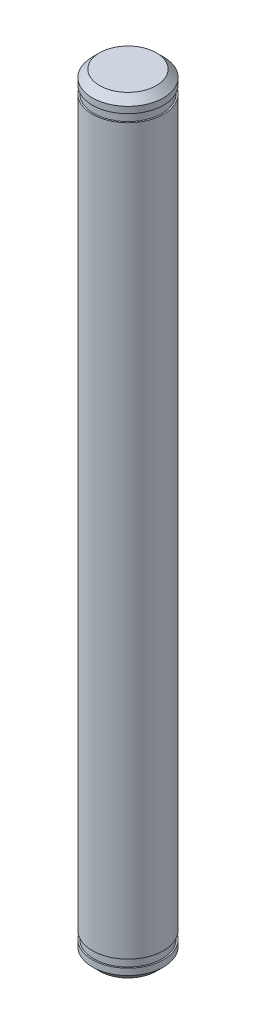
ISO-10303-21;
HEADER;
FILE_DESCRIPTION(('STEP AP214'),'2;1');
FILE_NAME('part.step','',(''),(''),'','','');
FILE_SCHEMA(('AUTOMOTIVE_DESIGN { 1 0 10303 214 1 1 1 1 }'));
ENDSEC;
DATA;
#1=APPLICATION_CONTEXT('core data for automotive mechanical design processes');
#2=APPLICATION_PROTOCOL_DEFINITION('international standard','automotive_design',2000,#1);
#3=PRODUCT_CONTEXT('',#1,'mechanical');
#4=PRODUCT('Part','Part','',(#3));
#5=PRODUCT_RELATED_PRODUCT_CATEGORY('part','',(#4));
#6=PRODUCT_DEFINITION_FORMATION('','',#4);
#7=PRODUCT_DEFINITION_CONTEXT('part definition',#1,'design');
#8=PRODUCT_DEFINITION('design','',#6,#7);
#9=PRODUCT_DEFINITION_SHAPE('','',#8);
#10=(LENGTH_UNIT() NAMED_UNIT(*) SI_UNIT(.MILLI.,.METRE.));
#11=(NAMED_UNIT(*) PLANE_ANGLE_UNIT() SI_UNIT($,.RADIAN.));
#12=(NAMED_UNIT(*) SI_UNIT($,.STERADIAN.) SOLID_ANGLE_UNIT());
#13=UNCERTAINTY_MEASURE_WITH_UNIT(LENGTH_MEASURE(1.E-05),#10,'distance_accuracy_value','');
#14=(GEOMETRIC_REPRESENTATION_CONTEXT(3) GLOBAL_UNCERTAINTY_ASSIGNED_CONTEXT((#13)) GLOBAL_UNIT_ASSIGNED_CONTEXT((#10,
#11,#12)) REPRESENTATION_CONTEXT('',''));
#15=CARTESIAN_POINT('',(0.,0.,0.));
#16=DIRECTION('',(0.,0.,1.));
#17=DIRECTION('',(1.,0.,0.));
#18=AXIS2_PLACEMENT_3D('',#15,#16,#17);
#19=CARTESIAN_POINT('',(0.,54.,0.));
#20=DIRECTION('',(0.,1.,0.));
#21=DIRECTION('',(-1.,0.,0.));
#22=AXIS2_PLACEMENT_3D('',#19,#20,#21);
#23=CYLINDRICAL_SURFACE('',#22,5.00000000000001);
#24=CARTESIAN_POINT('',(0.,51.,0.));
#25=DIRECTION('',(0.,1.,0.));
#26=DIRECTION('',(-1.,0.,0.));
#27=AXIS2_PLACEMENT_3D('',#24,#25,#26);
#28=CIRCLE('',#27,5.00000000000001);
#29=CARTESIAN_POINT('',(-5.00000000000002,51.,0.));
#30=VERTEX_POINT('',#29);
#31=EDGE_CURVE('E57',#30,#30,#28,.T.);
#32=ORIENTED_EDGE('',*,*,#31,.F.);
#33=EDGE_LOOP('',(#32));
#34=FACE_BOUND('',#33,.T.);
#35=CARTESIAN_POINT('',(0.,-51.,0.));
#36=DIRECTION('',(0.,1.,0.));
#37=DIRECTION('',(-1.,0.,0.));
#38=AXIS2_PLACEMENT_3D('',#35,#36,#37);
#39=CIRCLE('',#38,5.00000000000001);
#40=CARTESIAN_POINT('',(-5.,-51.,0.));
#41=VERTEX_POINT('',#40);
#42=EDGE_CURVE('E69',#41,#41,#39,.T.);
#43=ORIENTED_EDGE('',*,*,#42,.T.);
#44=EDGE_LOOP('',(#43));
#45=FACE_BOUND('',#44,.T.);
#46=ADVANCED_FACE('F35',(#34,#45),#23,.T.);
#47=CARTESIAN_POINT('',(0.,54.,0.));
#48=DIRECTION('',(0.,-1.,0.));
#49=DIRECTION('',(1.,0.,0.));
#50=AXIS2_PLACEMENT_3D('',#47,#48,#49);
#51=PLANE('',#50);
#52=CARTESIAN_POINT('',(0.,54.,0.));
#53=DIRECTION('',(0.,-1.,0.));
#54=DIRECTION('',(1.,0.,0.));
#55=AXIS2_PLACEMENT_3D('',#52,#53,#54);
#56=CIRCLE('',#55,4.00000000000002);
#57=CARTESIAN_POINT('',(4.,54.,0.));
#58=VERTEX_POINT('',#57);
#59=EDGE_CURVE('E10',#58,#58,#56,.F.);
#60=ORIENTED_EDGE('',*,*,#59,.T.);
#61=EDGE_LOOP('',(#60));
#62=FACE_BOUND('',#61,.T.);
#63=ADVANCED_FACE('F110',(#62),#51,.F.);
#64=CARTESIAN_POINT('',(0.,52.1,0.));
#65=DIRECTION('',(0.,1.,0.));
#66=DIRECTION('',(-1.,0.,0.));
#67=AXIS2_PLACEMENT_3D('',#64,#65,#66);
#68=CIRCLE('',#67,5.00000000000001);
#69=CARTESIAN_POINT('',(-5.00000000000002,52.1,0.));
#70=VERTEX_POINT('',#69);
#71=EDGE_CURVE('E56',#70,#70,#68,.T.);
#72=ORIENTED_EDGE('',*,*,#71,.T.);
#73=EDGE_LOOP('',(#72));
#74=FACE_BOUND('',#73,.T.);
#75=CARTESIAN_POINT('',(0.,53.,0.));
#76=DIRECTION('',(0.,-1.,0.));
#77=DIRECTION('',(1.,0.,0.));
#78=AXIS2_PLACEMENT_3D('',#75,#76,#77);
#79=CIRCLE('',#78,5.00000000000001);
#80=CARTESIAN_POINT('',(4.99999999999999,53.,0.));
#81=VERTEX_POINT('',#80);
#82=EDGE_CURVE('E51',#81,#81,#79,.T.);
#83=ORIENTED_EDGE('',*,*,#82,.T.);
#84=EDGE_LOOP('',(#83));
#85=FACE_BOUND('',#84,.T.);
#86=ADVANCED_FACE('F97',(#74,#85),#23,.T.);
#87=CARTESIAN_POINT('',(0.,54.,0.));
#88=DIRECTION('',(0.,-1.,0.));
#89=DIRECTION('',(1.,0.,0.));
#90=AXIS2_PLACEMENT_3D('',#87,#88,#89);
#91=CONICAL_SURFACE('',#90,4.00000000000002,0.785398163397447);
#92=ORIENTED_EDGE('',*,*,#82,.F.);
#93=EDGE_LOOP('',(#92));
#94=FACE_BOUND('',#93,.T.);
#95=ORIENTED_EDGE('',*,*,#59,.F.);
#96=EDGE_LOOP('',(#95));
#97=FACE_BOUND('',#96,.T.);
#98=ADVANCED_FACE('F38',(#94,#97),#91,.T.);
#99=CARTESIAN_POINT('',(0.,52.1,0.));
#100=DIRECTION('',(0.,1.,0.));
#101=DIRECTION('',(-1.,0.,0.));
#102=AXIS2_PLACEMENT_3D('',#99,#100,#101);
#103=PLANE('',#102);
#104=ORIENTED_EDGE('',*,*,#71,.F.);
#105=EDGE_LOOP('',(#104));
#106=FACE_BOUND('',#105,.T.);
#107=CARTESIAN_POINT('',(0.,52.1,0.));
#108=DIRECTION('',(0.,1.,0.));
#109=DIRECTION('',(-1.,0.,0.));
#110=AXIS2_PLACEMENT_3D('',#107,#108,#109);
#111=CIRCLE('',#110,4.8);
#112=CARTESIAN_POINT('',(-4.80000000000001,52.1,0.));
#113=VERTEX_POINT('',#112);
#114=EDGE_CURVE('E60',#113,#113,#111,.T.);
#115=ORIENTED_EDGE('',*,*,#114,.T.);
#116=EDGE_LOOP('',(#115));
#117=FACE_BOUND('',#116,.T.);
#118=ADVANCED_FACE('F122',(#106,#117),#103,.F.);
#119=CARTESIAN_POINT('',(0.,51.,0.));
#120=DIRECTION('',(0.,1.,0.));
#121=DIRECTION('',(-1.,0.,0.));
#122=AXIS2_PLACEMENT_3D('',#119,#120,#121);
#123=PLANE('',#122);
#124=ORIENTED_EDGE('',*,*,#31,.T.);
#125=EDGE_LOOP('',(#124));
#126=FACE_BOUND('',#125,.T.);
#127=CARTESIAN_POINT('',(0.,51.,0.));
#128=DIRECTION('',(0.,1.,0.));
#129=DIRECTION('',(-1.,0.,0.));
#130=AXIS2_PLACEMENT_3D('',#127,#128,#129);
#131=CIRCLE('',#130,4.8);
#132=CARTESIAN_POINT('',(-4.80000000000001,51.,0.));
#133=VERTEX_POINT('',#132);
#134=EDGE_CURVE('E63',#133,#133,#131,.T.);
#135=ORIENTED_EDGE('',*,*,#134,.F.);
#136=EDGE_LOOP('',(#135));
#137=FACE_BOUND('',#136,.T.);
#138=ADVANCED_FACE('F131',(#126,#137),#123,.T.);
#139=CARTESIAN_POINT('',(0.,52.1,0.));
#140=DIRECTION('',(0.,-1.,0.));
#141=DIRECTION('',(1.,0.,0.));
#142=AXIS2_PLACEMENT_3D('',#139,#140,#141);
#143=CYLINDRICAL_SURFACE('',#142,4.8);
#144=ORIENTED_EDGE('',*,*,#114,.F.);
#145=EDGE_LOOP('',(#144));
#146=FACE_BOUND('',#145,.T.);
#147=ORIENTED_EDGE('',*,*,#134,.T.);
#148=EDGE_LOOP('',(#147));
#149=FACE_BOUND('',#148,.T.);
#150=ADVANCED_FACE('F88',(#146,#149),#143,.T.);
#151=CARTESIAN_POINT('',(0.,-52.1,0.));
#152=DIRECTION('',(0.,-1.,0.));
#153=DIRECTION('',(-1.,0.,0.));
#154=AXIS2_PLACEMENT_3D('',#151,#152,#153);
#155=PLANE('',#154);
#156=CARTESIAN_POINT('',(0.,-52.1,0.));
#157=DIRECTION('',(0.,1.,0.));
#158=DIRECTION('',(-1.,0.,0.));
#159=AXIS2_PLACEMENT_3D('',#156,#157,#158);
#160=CIRCLE('',#159,4.8);
#161=CARTESIAN_POINT('',(-4.79999999999999,-52.1,0.));
#162=VERTEX_POINT('',#161);
#163=EDGE_CURVE('E72',#162,#162,#160,.T.);
#164=ORIENTED_EDGE('',*,*,#163,.F.);
#165=EDGE_LOOP('',(#164));
#166=FACE_BOUND('',#165,.T.);
#167=CARTESIAN_POINT('',(0.,-52.1,0.));
#168=DIRECTION('',(0.,1.,0.));
#169=DIRECTION('',(-1.,0.,0.));
#170=AXIS2_PLACEMENT_3D('',#167,#168,#169);
#171=CIRCLE('',#170,5.00000000000001);
#172=CARTESIAN_POINT('',(-5.,-52.1,0.));
#173=VERTEX_POINT('',#172);
#174=EDGE_CURVE('E66',#173,#173,#171,.T.);
#175=ORIENTED_EDGE('',*,*,#174,.T.);
#176=EDGE_LOOP('',(#175));
#177=FACE_BOUND('',#176,.T.);
#178=ADVANCED_FACE('F84',(#166,#177),#155,.F.);
#179=CARTESIAN_POINT('',(0.,-51.,0.));
#180=DIRECTION('',(0.,-1.,0.));
#181=DIRECTION('',(-1.,0.,0.));
#182=AXIS2_PLACEMENT_3D('',#179,#180,#181);
#183=PLANE('',#182);
#184=CARTESIAN_POINT('',(0.,-51.,0.));
#185=DIRECTION('',(0.,1.,0.));
#186=DIRECTION('',(-1.,0.,0.));
#187=AXIS2_PLACEMENT_3D('',#184,#185,#186);
#188=CIRCLE('',#187,4.8);
#189=CARTESIAN_POINT('',(-4.79999999999999,-51.,0.));
#190=VERTEX_POINT('',#189);
#191=EDGE_CURVE('E75',#190,#190,#188,.T.);
#192=ORIENTED_EDGE('',*,*,#191,.T.);
#193=EDGE_LOOP('',(#192));
#194=FACE_BOUND('',#193,.T.);
#195=ORIENTED_EDGE('',*,*,#42,.F.);
#196=EDGE_LOOP('',(#195));
#197=FACE_BOUND('',#196,.T.);
#198=ADVANCED_FACE('F87',(#194,#197),#183,.T.);
#199=CARTESIAN_POINT('',(0.,-52.1,0.));
#200=DIRECTION('',(0.,1.,0.));
#201=DIRECTION('',(-1.,0.,0.));
#202=AXIS2_PLACEMENT_3D('',#199,#200,#201);
#203=CYLINDRICAL_SURFACE('',#202,4.8);
#204=ORIENTED_EDGE('',*,*,#163,.T.);
#205=EDGE_LOOP('',(#204));
#206=FACE_BOUND('',#205,.T.);
#207=ORIENTED_EDGE('',*,*,#191,.F.);
#208=EDGE_LOOP('',(#207));
#209=FACE_BOUND('',#208,.T.);
#210=ADVANCED_FACE('F81',(#206,#209),#203,.T.);
#211=CARTESIAN_POINT('',(5.00000000000002,-54.,0.));
#212=DIRECTION('',(0.,1.,0.));
#213=DIRECTION('',(-1.,0.,0.));
#214=AXIS2_PLACEMENT_3D('',#211,#212,#213);
#215=PLANE('',#214);
#216=CARTESIAN_POINT('',(0.,-54.,0.));
#217=DIRECTION('',(0.,1.,0.));
#218=DIRECTION('',(-1.,0.,0.));
#219=AXIS2_PLACEMENT_3D('',#216,#217,#218);
#220=CIRCLE('',#219,4.00000000000009);
#221=CARTESIAN_POINT('',(-4.00000000000008,-54.,0.));
#222=VERTEX_POINT('',#221);
#223=EDGE_CURVE('E43',#222,#222,#220,.F.);
#224=ORIENTED_EDGE('',*,*,#223,.T.);
#225=EDGE_LOOP('',(#224));
#226=FACE_BOUND('',#225,.T.);
#227=ADVANCED_FACE('F101',(#226),#215,.F.);
#228=CARTESIAN_POINT('',(0.,-53.0000000000001,0.));
#229=DIRECTION('',(0.,1.,0.));
#230=DIRECTION('',(-1.,0.,0.));
#231=AXIS2_PLACEMENT_3D('',#228,#229,#230);
#232=CONICAL_SURFACE('',#231,5.00000000000001,0.785398163397457);
#233=ORIENTED_EDGE('',*,*,#223,.F.);
#234=EDGE_LOOP('',(#233));
#235=FACE_BOUND('',#234,.T.);
#236=CARTESIAN_POINT('',(0.,-53.0000000000001,0.));
#237=DIRECTION('',(0.,1.,0.));
#238=DIRECTION('',(-1.,0.,0.));
#239=AXIS2_PLACEMENT_3D('',#236,#237,#238);
#240=CIRCLE('',#239,5.00000000000001);
#241=CARTESIAN_POINT('',(-5.,-53.0000000000001,0.));
#242=VERTEX_POINT('',#241);
#243=EDGE_CURVE('E47',#242,#242,#240,.T.);
#244=ORIENTED_EDGE('',*,*,#243,.F.);
#245=EDGE_LOOP('',(#244));
#246=FACE_BOUND('',#245,.T.);
#247=ADVANCED_FACE('F95',(#235,#246),#232,.T.);
#248=ORIENTED_EDGE('',*,*,#174,.F.);
#249=EDGE_LOOP('',(#248));
#250=FACE_BOUND('',#249,.T.);
#251=ORIENTED_EDGE('',*,*,#243,.T.);
#252=EDGE_LOOP('',(#251));
#253=FACE_BOUND('',#252,.T.);
#254=ADVANCED_FACE('F92',(#250,#253),#23,.T.);
#255=CLOSED_SHELL('',(#46,#63,#86,#98,#118,#138,#150,#178,#198,#210,#227,#247,#254));
#256=MANIFOLD_SOLID_BREP('B2',#255);
#257=ADVANCED_BREP_SHAPE_REPRESENTATION('',(#18,#256),#14);
#258=SHAPE_DEFINITION_REPRESENTATION(#9,#257);
ENDSEC;
END-ISO-10303-21;
